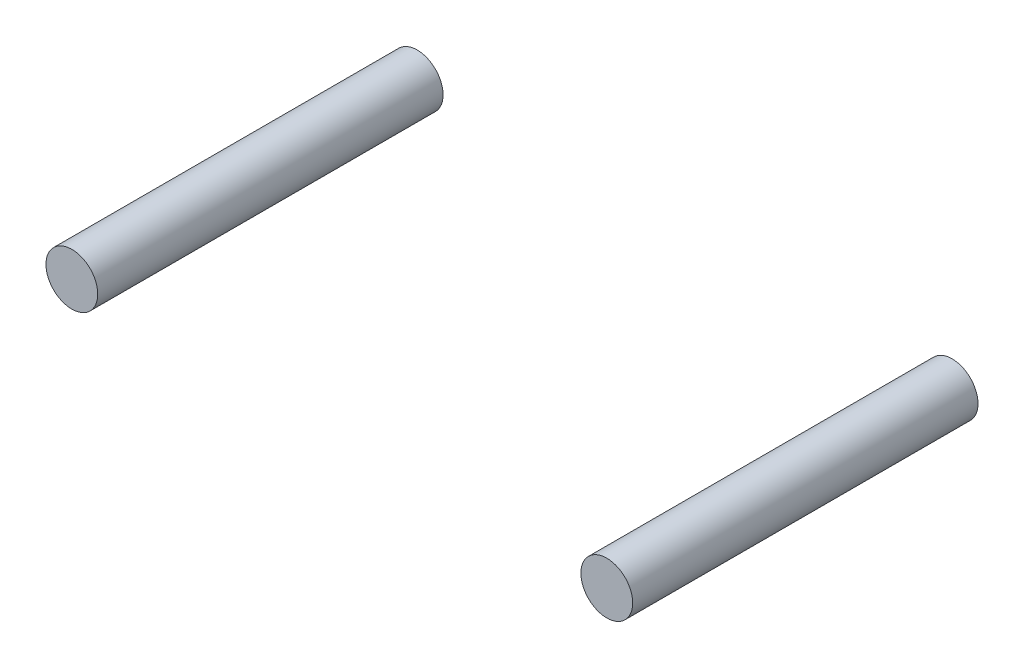
ISO-10303-21;
HEADER;
FILE_DESCRIPTION(('STEP AP214'),'2;1');
FILE_NAME('part.step','',(''),(''),'','','');
FILE_SCHEMA(('AUTOMOTIVE_DESIGN { 1 0 10303 214 1 1 1 1 }'));
ENDSEC;
DATA;
#1=APPLICATION_CONTEXT('core data for automotive mechanical design processes');
#2=APPLICATION_PROTOCOL_DEFINITION('international standard','automotive_design',2000,#1);
#3=PRODUCT_CONTEXT('',#1,'mechanical');
#4=PRODUCT('Part','Part','',(#3));
#5=PRODUCT_RELATED_PRODUCT_CATEGORY('part','',(#4));
#6=PRODUCT_DEFINITION_FORMATION('','',#4);
#7=PRODUCT_DEFINITION_CONTEXT('part definition',#1,'design');
#8=PRODUCT_DEFINITION('design','',#6,#7);
#9=PRODUCT_DEFINITION_SHAPE('','',#8);
#10=(LENGTH_UNIT() NAMED_UNIT(*) SI_UNIT(.MILLI.,.METRE.));
#11=(NAMED_UNIT(*) PLANE_ANGLE_UNIT() SI_UNIT($,.RADIAN.));
#12=(NAMED_UNIT(*) SI_UNIT($,.STERADIAN.) SOLID_ANGLE_UNIT());
#13=UNCERTAINTY_MEASURE_WITH_UNIT(LENGTH_MEASURE(1.E-05),#10,'distance_accuracy_value','');
#14=(GEOMETRIC_REPRESENTATION_CONTEXT(3) GLOBAL_UNCERTAINTY_ASSIGNED_CONTEXT((#13)) GLOBAL_UNIT_ASSIGNED_CONTEXT((#10,
#11,#12)) REPRESENTATION_CONTEXT('',''));
#15=CARTESIAN_POINT('',(0.,0.,0.));
#16=DIRECTION('',(0.,0.,1.));
#17=DIRECTION('',(1.,0.,0.));
#18=AXIS2_PLACEMENT_3D('',#15,#16,#17);
#19=CARTESIAN_POINT('',(0.774525590912861,10.4318690787579,0.5));
#20=DIRECTION('',(0.,0.,-1.));
#21=DIRECTION('',(-1.,0.,0.));
#22=AXIS2_PLACEMENT_3D('',#19,#20,#21);
#23=CYLINDRICAL_SURFACE('',#22,0.0750000000000002);
#24=CARTESIAN_POINT('',(0.774525590912861,10.4318690787579,0.5));
#25=DIRECTION('',(0.,0.,1.));
#26=DIRECTION('',(1.,0.,0.));
#27=AXIS2_PLACEMENT_3D('',#24,#25,#26);
#28=CIRCLE('',#27,0.0750000000000002);
#29=CARTESIAN_POINT('',(0.849525590912862,10.4318690787579,0.5));
#30=VERTEX_POINT('',#29);
#31=EDGE_CURVE('E11',#30,#30,#28,.F.);
#32=ORIENTED_EDGE('',*,*,#31,.T.);
#33=EDGE_LOOP('',(#32));
#34=FACE_BOUND('',#33,.T.);
#35=CARTESIAN_POINT('',(0.774525590912861,10.4318690787579,-0.5));
#36=DIRECTION('',(0.,0.,1.));
#37=DIRECTION('',(1.,0.,0.));
#38=AXIS2_PLACEMENT_3D('',#35,#36,#37);
#39=CIRCLE('',#38,0.0750000000000002);
#40=CARTESIAN_POINT('',(0.849525590912862,10.4318690787579,-0.5));
#41=VERTEX_POINT('',#40);
#42=EDGE_CURVE('E41',#41,#41,#39,.F.);
#43=ORIENTED_EDGE('',*,*,#42,.F.);
#44=EDGE_LOOP('',(#43));
#45=FACE_BOUND('',#44,.T.);
#46=ADVANCED_FACE('F38',(#34,#45),#23,.T.);
#47=CARTESIAN_POINT('',(0.,0.,0.5));
#48=DIRECTION('',(0.,0.,1.));
#49=DIRECTION('',(1.,0.,0.));
#50=AXIS2_PLACEMENT_3D('',#47,#48,#49);
#51=PLANE('',#50);
#52=ORIENTED_EDGE('',*,*,#31,.F.);
#53=EDGE_LOOP('',(#52));
#54=FACE_BOUND('',#53,.T.);
#55=ADVANCED_FACE('F53',(#54),#51,.T.);
#56=CARTESIAN_POINT('',(0.,0.,-0.5));
#57=DIRECTION('',(0.,0.,1.));
#58=DIRECTION('',(1.,0.,0.));
#59=AXIS2_PLACEMENT_3D('',#56,#57,#58);
#60=PLANE('',#59);
#61=ORIENTED_EDGE('',*,*,#42,.T.);
#62=EDGE_LOOP('',(#61));
#63=FACE_BOUND('',#62,.T.);
#64=ADVANCED_FACE('F50',(#63),#60,.F.);
#65=CLOSED_SHELL('',(#46,#55,#64));
#66=MANIFOLD_SOLID_BREP('B2',#65);
#67=CARTESIAN_POINT('',(-0.774525590912949,10.4318690787579,0.5));
#68=DIRECTION('',(0.,0.,-1.));
#69=DIRECTION('',(-1.,0.,0.));
#70=AXIS2_PLACEMENT_3D('',#67,#68,#69);
#71=CYLINDRICAL_SURFACE('',#70,0.0750000000000002);
#72=CARTESIAN_POINT('',(-0.774525590912949,10.4318690787579,0.5));
#73=DIRECTION('',(0.,0.,1.));
#74=DIRECTION('',(1.,0.,0.));
#75=AXIS2_PLACEMENT_3D('',#72,#73,#74);
#76=CIRCLE('',#75,0.0750000000000002);
#77=CARTESIAN_POINT('',(-0.699525590912949,10.4318690787579,0.5));
#78=VERTEX_POINT('',#77);
#79=EDGE_CURVE('E37',#78,#78,#76,.T.);
#80=ORIENTED_EDGE('',*,*,#79,.F.);
#81=EDGE_LOOP('',(#80));
#82=FACE_BOUND('',#81,.T.);
#83=CARTESIAN_POINT('',(-0.774525590912949,10.4318690787579,-0.5));
#84=DIRECTION('',(0.,0.,1.));
#85=DIRECTION('',(1.,0.,0.));
#86=AXIS2_PLACEMENT_3D('',#83,#84,#85);
#87=CIRCLE('',#86,0.0750000000000002);
#88=CARTESIAN_POINT('',(-0.699525590912949,10.4318690787579,-0.5));
#89=VERTEX_POINT('',#88);
#90=EDGE_CURVE('E87',#89,#89,#87,.T.);
#91=ORIENTED_EDGE('',*,*,#90,.T.);
#92=EDGE_LOOP('',(#91));
#93=FACE_BOUND('',#92,.T.);
#94=ADVANCED_FACE('F84',(#82,#93),#71,.T.);
#95=CARTESIAN_POINT('',(0.,0.,0.5));
#96=DIRECTION('',(0.,0.,1.));
#97=DIRECTION('',(1.,0.,0.));
#98=AXIS2_PLACEMENT_3D('',#95,#96,#97);
#99=PLANE('',#98);
#100=ORIENTED_EDGE('',*,*,#79,.T.);
#101=EDGE_LOOP('',(#100));
#102=FACE_BOUND('',#101,.T.);
#103=ADVANCED_FACE('F99',(#102),#99,.T.);
#104=CARTESIAN_POINT('',(0.,0.,-0.5));
#105=DIRECTION('',(0.,0.,1.));
#106=DIRECTION('',(1.,0.,0.));
#107=AXIS2_PLACEMENT_3D('',#104,#105,#106);
#108=PLANE('',#107);
#109=ORIENTED_EDGE('',*,*,#90,.F.);
#110=EDGE_LOOP('',(#109));
#111=FACE_BOUND('',#110,.T.);
#112=ADVANCED_FACE('F97',(#111),#108,.F.);
#113=CLOSED_SHELL('',(#94,#103,#112));
#114=MANIFOLD_SOLID_BREP('B6',#113);
#115=ADVANCED_BREP_SHAPE_REPRESENTATION('',(#18,#66,#114),#14);
#116=SHAPE_DEFINITION_REPRESENTATION(#9,#115);
ENDSEC;
END-ISO-10303-21;
